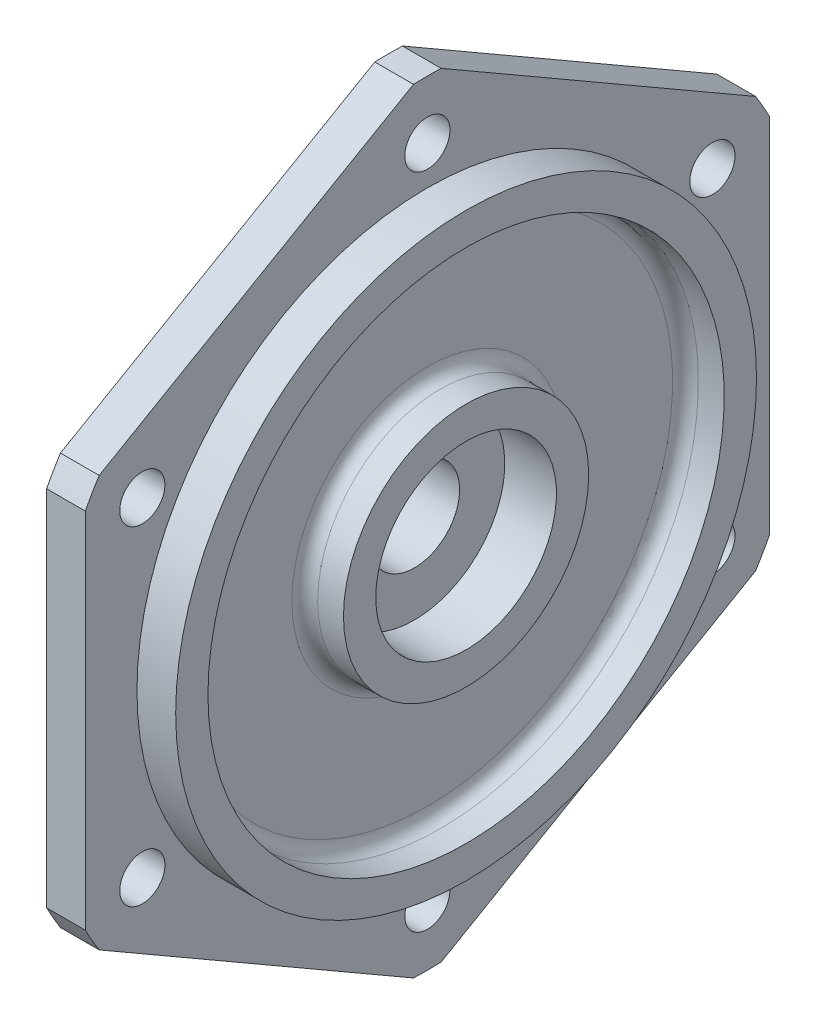
ISO-10303-21;
HEADER;
FILE_DESCRIPTION(('STEP AP214'),'2;1');
FILE_NAME('part.step','',(''),(''),'','','');
FILE_SCHEMA(('AUTOMOTIVE_DESIGN { 1 0 10303 214 1 1 1 1 }'));
ENDSEC;
DATA;
#1=APPLICATION_CONTEXT('core data for automotive mechanical design processes');
#2=APPLICATION_PROTOCOL_DEFINITION('international standard','automotive_design',2000,#1);
#3=PRODUCT_CONTEXT('',#1,'mechanical');
#4=PRODUCT('Part','Part','',(#3));
#5=PRODUCT_RELATED_PRODUCT_CATEGORY('part','',(#4));
#6=PRODUCT_DEFINITION_FORMATION('','',#4);
#7=PRODUCT_DEFINITION_CONTEXT('part definition',#1,'design');
#8=PRODUCT_DEFINITION('design','',#6,#7);
#9=PRODUCT_DEFINITION_SHAPE('','',#8);
#10=(LENGTH_UNIT() NAMED_UNIT(*) SI_UNIT(.MILLI.,.METRE.));
#11=(NAMED_UNIT(*) PLANE_ANGLE_UNIT() SI_UNIT($,.RADIAN.));
#12=(NAMED_UNIT(*) SI_UNIT($,.STERADIAN.) SOLID_ANGLE_UNIT());
#13=UNCERTAINTY_MEASURE_WITH_UNIT(LENGTH_MEASURE(1.E-05),#10,'distance_accuracy_value','');
#14=(GEOMETRIC_REPRESENTATION_CONTEXT(3) GLOBAL_UNCERTAINTY_ASSIGNED_CONTEXT((#13)) GLOBAL_UNIT_ASSIGNED_CONTEXT((#10,
#11,#12)) REPRESENTATION_CONTEXT('',''));
#15=CARTESIAN_POINT('',(0.,0.,0.));
#16=DIRECTION('',(0.,0.,1.));
#17=DIRECTION('',(1.,0.,0.));
#18=AXIS2_PLACEMENT_3D('',#15,#16,#17);
#19=CARTESIAN_POINT('',(-4.,23.,0.));
#20=DIRECTION('',(1.,0.,0.));
#21=DIRECTION('',(0.,0.,-1.));
#22=AXIS2_PLACEMENT_3D('',#19,#20,#21);
#23=PLANE('',#22);
#24=CARTESIAN_POINT('',(-4.,0.,0.));
#25=DIRECTION('',(1.,0.,0.));
#26=DIRECTION('',(0.,0.,-1.));
#27=AXIS2_PLACEMENT_3D('',#24,#25,#26);
#28=CIRCLE('',#27,25.);
#29=CARTESIAN_POINT('',(-4.,0.,-25.));
#30=VERTEX_POINT('',#29);
#31=EDGE_CURVE('E408',#30,#30,#28,.T.);
#32=ORIENTED_EDGE('',*,*,#31,.T.);
#33=EDGE_LOOP('',(#32));
#34=FACE_BOUND('',#33,.T.);
#35=CARTESIAN_POINT('',(-4.,51.,0.));
#36=DIRECTION('',(1.,0.,0.));
#37=DIRECTION('',(0.,0.,-1.));
#38=AXIS2_PLACEMENT_3D('',#35,#36,#37);
#39=CIRCLE('',#38,3.5);
#40=CARTESIAN_POINT('',(-4.,51.,-3.5));
#41=VERTEX_POINT('',#40);
#42=EDGE_CURVE('E220',#41,#41,#39,.T.);
#43=ORIENTED_EDGE('',*,*,#42,.T.);
#44=EDGE_LOOP('',(#43));
#45=FACE_BOUND('',#44,.T.);
#46=CARTESIAN_POINT('',(-4.,25.5,44.1672955930064));
#47=DIRECTION('',(1.,0.,0.));
#48=DIRECTION('',(0.,0.,-1.));
#49=AXIS2_PLACEMENT_3D('',#46,#47,#48);
#50=CIRCLE('',#49,3.49999999999999);
#51=CARTESIAN_POINT('',(-4.,25.5,40.6672955930064));
#52=VERTEX_POINT('',#51);
#53=EDGE_CURVE('E224',#52,#52,#50,.T.);
#54=ORIENTED_EDGE('',*,*,#53,.T.);
#55=EDGE_LOOP('',(#54));
#56=FACE_BOUND('',#55,.T.);
#57=CARTESIAN_POINT('',(-4.,-25.5,44.1672955930064));
#58=DIRECTION('',(1.,0.,0.));
#59=DIRECTION('',(0.,0.,-1.));
#60=AXIS2_PLACEMENT_3D('',#57,#58,#59);
#61=CIRCLE('',#60,3.5);
#62=CARTESIAN_POINT('',(-4.,-25.5,40.6672955930064));
#63=VERTEX_POINT('',#62);
#64=EDGE_CURVE('E228',#63,#63,#61,.T.);
#65=ORIENTED_EDGE('',*,*,#64,.T.);
#66=EDGE_LOOP('',(#65));
#67=FACE_BOUND('',#66,.T.);
#68=CARTESIAN_POINT('',(-4.,-51.,0.));
#69=DIRECTION('',(1.,0.,0.));
#70=DIRECTION('',(0.,0.,-1.));
#71=AXIS2_PLACEMENT_3D('',#68,#69,#70);
#72=CIRCLE('',#71,3.5);
#73=CARTESIAN_POINT('',(-4.,-51.,-3.50000000000001));
#74=VERTEX_POINT('',#73);
#75=EDGE_CURVE('E232',#74,#74,#72,.T.);
#76=ORIENTED_EDGE('',*,*,#75,.T.);
#77=EDGE_LOOP('',(#76));
#78=FACE_BOUND('',#77,.T.);
#79=CARTESIAN_POINT('',(-4.,-25.5,-44.1672955930064));
#80=DIRECTION('',(1.,0.,0.));
#81=DIRECTION('',(0.,0.,-1.));
#82=AXIS2_PLACEMENT_3D('',#79,#80,#81);
#83=CIRCLE('',#82,3.5);
#84=CARTESIAN_POINT('',(-4.,-25.5,-47.6672955930064));
#85=VERTEX_POINT('',#84);
#86=EDGE_CURVE('E236',#85,#85,#83,.T.);
#87=ORIENTED_EDGE('',*,*,#86,.T.);
#88=EDGE_LOOP('',(#87));
#89=FACE_BOUND('',#88,.T.);
#90=CARTESIAN_POINT('',(-4.,25.5,-44.1672955930064));
#91=DIRECTION('',(1.,0.,0.));
#92=DIRECTION('',(0.,0.,-1.));
#93=AXIS2_PLACEMENT_3D('',#90,#91,#92);
#94=CIRCLE('',#93,3.5);
#95=CARTESIAN_POINT('',(-4.,25.5,-47.6672955930064));
#96=VERTEX_POINT('',#95);
#97=EDGE_CURVE('E240',#96,#96,#94,.T.);
#98=ORIENTED_EDGE('',*,*,#97,.T.);
#99=EDGE_LOOP('',(#98));
#100=FACE_BOUND('',#99,.T.);
#101=DIRECTION('',(0.,-1.,0.));
#102=VECTOR('',#101,1.);
#103=CARTESIAN_POINT('',(-4.,0.,-53.));
#104=LINE('',#103,#102);
#105=CARTESIAN_POINT('',(-4.,28.1247222208505,-53.));
#106=VERTEX_POINT('',#105);
#107=CARTESIAN_POINT('',(-4.,-28.1247222208505,-53.));
#108=VERTEX_POINT('',#107);
#109=EDGE_CURVE('E284',#106,#108,#104,.T.);
#110=ORIENTED_EDGE('',*,*,#109,.T.);
#111=CARTESIAN_POINT('',(-4.,0.,0.));
#112=DIRECTION('',(-1.,0.,0.));
#113=DIRECTION('',(0.,0.,1.));
#114=AXIS2_PLACEMENT_3D('',#111,#112,#113);
#115=CIRCLE('',#114,60.);
#116=CARTESIAN_POINT('',(-4.,-31.8369852901501,-50.8567239176372));
#117=VERTEX_POINT('',#116);
#118=EDGE_CURVE('E174',#108,#117,#115,.T.);
#119=ORIENTED_EDGE('',*,*,#118,.T.);
#120=DIRECTION('',(0.,-0.5,0.866025403784439));
#121=VECTOR('',#120,1.);
#122=CARTESIAN_POINT('',(-4.,-45.8993464005753,-26.5));
#123=LINE('',#122,#121);
#124=CARTESIAN_POINT('',(-4.,-59.9617075110005,-2.14327608236285));
#125=VERTEX_POINT('',#124);
#126=EDGE_CURVE('E287',#117,#125,#123,.T.);
#127=ORIENTED_EDGE('',*,*,#126,.T.);
#128=CARTESIAN_POINT('',(-4.,-59.9617075110005,2.1432760823628));
#129=VERTEX_POINT('',#128);
#130=EDGE_CURVE('E168',#125,#129,#115,.T.);
#131=ORIENTED_EDGE('',*,*,#130,.T.);
#132=DIRECTION('',(0.,0.5,0.866025403784439));
#133=VECTOR('',#132,1.);
#134=CARTESIAN_POINT('',(-4.,-45.8993464005753,26.5));
#135=LINE('',#134,#133);
#136=CARTESIAN_POINT('',(-4.,-31.8369852901501,50.8567239176372));
#137=VERTEX_POINT('',#136);
#138=EDGE_CURVE('E297',#129,#137,#135,.T.);
#139=ORIENTED_EDGE('',*,*,#138,.T.);
#140=CARTESIAN_POINT('',(-4.,-28.1247222208505,53.));
#141=VERTEX_POINT('',#140);
#142=EDGE_CURVE('E159',#137,#141,#115,.T.);
#143=ORIENTED_EDGE('',*,*,#142,.T.);
#144=DIRECTION('',(0.,1.,0.));
#145=VECTOR('',#144,1.);
#146=CARTESIAN_POINT('',(-4.,0.,53.));
#147=LINE('',#146,#145);
#148=CARTESIAN_POINT('',(-4.,28.1247222208505,53.));
#149=VERTEX_POINT('',#148);
#150=EDGE_CURVE('E154',#141,#149,#147,.T.);
#151=ORIENTED_EDGE('',*,*,#150,.T.);
#152=CARTESIAN_POINT('',(-4.,31.83698529015,50.8567239176372));
#153=VERTEX_POINT('',#152);
#154=EDGE_CURVE('E146',#149,#153,#115,.T.);
#155=ORIENTED_EDGE('',*,*,#154,.T.);
#156=DIRECTION('',(0.,0.5,-0.866025403784439));
#157=VECTOR('',#156,1.);
#158=CARTESIAN_POINT('',(-4.,45.8993464005752,26.5));
#159=LINE('',#158,#157);
#160=CARTESIAN_POINT('',(-4.,59.9617075110005,2.14327608236283));
#161=VERTEX_POINT('',#160);
#162=EDGE_CURVE('E127',#153,#161,#159,.T.);
#163=ORIENTED_EDGE('',*,*,#162,.T.);
#164=CARTESIAN_POINT('',(-4.,59.9617075110005,-2.14327608236285));
#165=VERTEX_POINT('',#164);
#166=EDGE_CURVE('E157',#161,#165,#115,.T.);
#167=ORIENTED_EDGE('',*,*,#166,.T.);
#168=DIRECTION('',(0.,-0.5,-0.866025403784439));
#169=VECTOR('',#168,1.);
#170=CARTESIAN_POINT('',(-4.,45.8993464005753,-26.5));
#171=LINE('',#170,#169);
#172=CARTESIAN_POINT('',(-4.,31.8369852901501,-50.8567239176372));
#173=VERTEX_POINT('',#172);
#174=EDGE_CURVE('E273',#165,#173,#171,.T.);
#175=ORIENTED_EDGE('',*,*,#174,.T.);
#176=EDGE_CURVE('E165',#173,#106,#115,.T.);
#177=ORIENTED_EDGE('',*,*,#176,.T.);
#178=EDGE_LOOP('',(#110,#119,#127,#131,#139,#143,#151,#155,#163,#167,#175,#177));
#179=FACE_BOUND('',#178,.T.);
#180=ADVANCED_FACE('F39',(#34,#45,#56,#67,#78,#89,#100,#179),#23,.F.);
#181=CARTESIAN_POINT('',(0.,0.,0.));
#182=DIRECTION('',(-1.,0.,0.));
#183=DIRECTION('',(0.,0.,1.));
#184=AXIS2_PLACEMENT_3D('',#181,#182,#183);
#185=CYLINDRICAL_SURFACE('',#184,60.);
#186=DIRECTION('',(-1.,0.,0.));
#187=VECTOR('',#186,1.);
#188=CARTESIAN_POINT('',(6.,-28.1247222208505,-53.));
#189=LINE('',#188,#187);
#190=CARTESIAN_POINT('',(2.,-28.1247222208505,-53.));
#191=VERTEX_POINT('',#190);
#192=EDGE_CURVE('E283',#191,#108,#189,.T.);
#193=ORIENTED_EDGE('',*,*,#192,.F.);
#194=CARTESIAN_POINT('',(2.,0.,0.));
#195=DIRECTION('',(-1.,0.,0.));
#196=DIRECTION('',(0.,0.,1.));
#197=AXIS2_PLACEMENT_3D('',#194,#195,#196);
#198=CIRCLE('',#197,60.);
#199=CARTESIAN_POINT('',(2.,-31.83698529015,-50.8567239176372));
#200=VERTEX_POINT('',#199);
#201=EDGE_CURVE('E191',#191,#200,#198,.T.);
#202=ORIENTED_EDGE('',*,*,#201,.T.);
#203=DIRECTION('',(-1.,0.,0.));
#204=VECTOR('',#203,1.);
#205=CARTESIAN_POINT('',(6.,-31.8369852901501,-50.8567239176372));
#206=LINE('',#205,#204);
#207=EDGE_CURVE('E290',#200,#117,#206,.T.);
#208=ORIENTED_EDGE('',*,*,#207,.T.);
#209=ORIENTED_EDGE('',*,*,#118,.F.);
#210=EDGE_LOOP('',(#193,#202,#208,#209));
#211=FACE_BOUND('',#210,.T.);
#212=ADVANCED_FACE('F356',(#211),#185,.T.);
#213=DIRECTION('',(-1.,0.,0.));
#214=VECTOR('',#213,1.);
#215=CARTESIAN_POINT('',(6.,28.1247222208505,-53.));
#216=LINE('',#215,#214);
#217=CARTESIAN_POINT('',(2.,28.1247222208505,-53.));
#218=VERTEX_POINT('',#217);
#219=EDGE_CURVE('E279',#218,#106,#216,.T.);
#220=ORIENTED_EDGE('',*,*,#219,.T.);
#221=ORIENTED_EDGE('',*,*,#176,.F.);
#222=DIRECTION('',(-1.,0.,0.));
#223=VECTOR('',#222,1.);
#224=CARTESIAN_POINT('',(6.,31.8369852901501,-50.8567239176372));
#225=LINE('',#224,#223);
#226=CARTESIAN_POINT('',(2.,31.8369852901501,-50.8567239176372));
#227=VERTEX_POINT('',#226);
#228=EDGE_CURVE('E265',#227,#173,#225,.T.);
#229=ORIENTED_EDGE('',*,*,#228,.F.);
#230=EDGE_CURVE('E179',#227,#218,#198,.T.);
#231=ORIENTED_EDGE('',*,*,#230,.T.);
#232=EDGE_LOOP('',(#220,#221,#229,#231));
#233=FACE_BOUND('',#232,.T.);
#234=ADVANCED_FACE('F355',(#233),#185,.T.);
#235=DIRECTION('',(-1.,0.,0.));
#236=VECTOR('',#235,1.);
#237=CARTESIAN_POINT('',(6.,-59.9617075110005,-2.14327608236285));
#238=LINE('',#237,#236);
#239=CARTESIAN_POINT('',(2.,-59.9617075110005,-2.14327608236285));
#240=VERTEX_POINT('',#239);
#241=EDGE_CURVE('E294',#240,#125,#238,.T.);
#242=ORIENTED_EDGE('',*,*,#241,.F.);
#243=CARTESIAN_POINT('',(2.,-59.9617075110005,2.1432760823628));
#244=VERTEX_POINT('',#243);
#245=EDGE_CURVE('E183',#240,#244,#198,.T.);
#246=ORIENTED_EDGE('',*,*,#245,.T.);
#247=DIRECTION('',(-1.,0.,0.));
#248=VECTOR('',#247,1.);
#249=CARTESIAN_POINT('',(6.,-59.9617075110005,2.1432760823628));
#250=LINE('',#249,#248);
#251=EDGE_CURVE('E63',#244,#129,#250,.T.);
#252=ORIENTED_EDGE('',*,*,#251,.T.);
#253=ORIENTED_EDGE('',*,*,#130,.F.);
#254=EDGE_LOOP('',(#242,#246,#252,#253));
#255=FACE_BOUND('',#254,.T.);
#256=ADVANCED_FACE('F345',(#255),#185,.T.);
#257=DIRECTION('',(-1.,0.,0.));
#258=VECTOR('',#257,1.);
#259=CARTESIAN_POINT('',(6.,-31.8369852901501,50.8567239176372));
#260=LINE('',#259,#258);
#261=CARTESIAN_POINT('',(2.,-31.8369852901501,50.8567239176372));
#262=VERTEX_POINT('',#261);
#263=EDGE_CURVE('E303',#262,#137,#260,.T.);
#264=ORIENTED_EDGE('',*,*,#263,.F.);
#265=CARTESIAN_POINT('',(2.,-28.1247222208505,53.));
#266=VERTEX_POINT('',#265);
#267=EDGE_CURVE('E176',#262,#266,#198,.T.);
#268=ORIENTED_EDGE('',*,*,#267,.T.);
#269=DIRECTION('',(-1.,0.,0.));
#270=VECTOR('',#269,1.);
#271=CARTESIAN_POINT('',(6.,-28.1247222208505,53.));
#272=LINE('',#271,#270);
#273=EDGE_CURVE('E55',#266,#141,#272,.T.);
#274=ORIENTED_EDGE('',*,*,#273,.T.);
#275=ORIENTED_EDGE('',*,*,#142,.F.);
#276=EDGE_LOOP('',(#264,#268,#274,#275));
#277=FACE_BOUND('',#276,.T.);
#278=ADVANCED_FACE('F347',(#277),#185,.T.);
#279=DIRECTION('',(-1.,0.,0.));
#280=VECTOR('',#279,1.);
#281=CARTESIAN_POINT('',(6.,28.1247222208505,53.));
#282=LINE('',#281,#280);
#283=CARTESIAN_POINT('',(2.,28.1247222208505,53.));
#284=VERTEX_POINT('',#283);
#285=EDGE_CURVE('E139',#284,#149,#282,.T.);
#286=ORIENTED_EDGE('',*,*,#285,.F.);
#287=CARTESIAN_POINT('',(2.,31.83698529015,50.8567239176372));
#288=VERTEX_POINT('',#287);
#289=EDGE_CURVE('E148',#284,#288,#198,.T.);
#290=ORIENTED_EDGE('',*,*,#289,.T.);
#291=DIRECTION('',(-1.,0.,0.));
#292=VECTOR('',#291,1.);
#293=CARTESIAN_POINT('',(6.,31.83698529015,50.8567239176372));
#294=LINE('',#293,#292);
#295=EDGE_CURVE('E130',#288,#153,#294,.T.);
#296=ORIENTED_EDGE('',*,*,#295,.T.);
#297=ORIENTED_EDGE('',*,*,#154,.F.);
#298=EDGE_LOOP('',(#286,#290,#296,#297));
#299=FACE_BOUND('',#298,.T.);
#300=ADVANCED_FACE('F145',(#299),#185,.T.);
#301=DIRECTION('',(-1.,0.,0.));
#302=VECTOR('',#301,1.);
#303=CARTESIAN_POINT('',(6.,59.9617075110005,2.14327608236283));
#304=LINE('',#303,#302);
#305=CARTESIAN_POINT('',(2.,59.9617075110005,2.14327608236283));
#306=VERTEX_POINT('',#305);
#307=EDGE_CURVE('E133',#306,#161,#304,.T.);
#308=ORIENTED_EDGE('',*,*,#307,.F.);
#309=CARTESIAN_POINT('',(2.,59.9617075110005,-2.14327608236285));
#310=VERTEX_POINT('',#309);
#311=EDGE_CURVE('E175',#306,#310,#198,.T.);
#312=ORIENTED_EDGE('',*,*,#311,.T.);
#313=DIRECTION('',(-1.,0.,0.));
#314=VECTOR('',#313,1.);
#315=CARTESIAN_POINT('',(6.,59.9617075110005,-2.14327608236285));
#316=LINE('',#315,#314);
#317=EDGE_CURVE('E269',#310,#165,#316,.T.);
#318=ORIENTED_EDGE('',*,*,#317,.T.);
#319=ORIENTED_EDGE('',*,*,#166,.F.);
#320=EDGE_LOOP('',(#308,#312,#318,#319));
#321=FACE_BOUND('',#320,.T.);
#322=ADVANCED_FACE('F354',(#321),#185,.T.);
#323=CARTESIAN_POINT('',(2.,60.,0.));
#324=DIRECTION('',(-1.,0.,0.));
#325=DIRECTION('',(0.,0.,1.));
#326=AXIS2_PLACEMENT_3D('',#323,#324,#325);
#327=PLANE('',#326);
#328=CARTESIAN_POINT('',(2.,51.,0.));
#329=DIRECTION('',(1.,0.,0.));
#330=DIRECTION('',(0.,0.,-1.));
#331=AXIS2_PLACEMENT_3D('',#328,#329,#330);
#332=CIRCLE('',#331,3.5);
#333=CARTESIAN_POINT('',(2.,51.,-3.5));
#334=VERTEX_POINT('',#333);
#335=EDGE_CURVE('E244',#334,#334,#332,.T.);
#336=ORIENTED_EDGE('',*,*,#335,.F.);
#337=EDGE_LOOP('',(#336));
#338=FACE_BOUND('',#337,.T.);
#339=CARTESIAN_POINT('',(2.,25.5,44.1672955930064));
#340=DIRECTION('',(1.,0.,0.));
#341=DIRECTION('',(0.,0.,-1.));
#342=AXIS2_PLACEMENT_3D('',#339,#340,#341);
#343=CIRCLE('',#342,3.49999999999999);
#344=CARTESIAN_POINT('',(2.,25.5,40.6672955930064));
#345=VERTEX_POINT('',#344);
#346=EDGE_CURVE('E250',#345,#345,#343,.T.);
#347=ORIENTED_EDGE('',*,*,#346,.F.);
#348=EDGE_LOOP('',(#347));
#349=FACE_BOUND('',#348,.T.);
#350=CARTESIAN_POINT('',(2.,-25.5,44.1672955930064));
#351=DIRECTION('',(1.,0.,0.));
#352=DIRECTION('',(0.,0.,-1.));
#353=AXIS2_PLACEMENT_3D('',#350,#351,#352);
#354=CIRCLE('',#353,3.5);
#355=CARTESIAN_POINT('',(2.,-25.5,40.6672955930064));
#356=VERTEX_POINT('',#355);
#357=EDGE_CURVE('E245',#356,#356,#354,.T.);
#358=ORIENTED_EDGE('',*,*,#357,.F.);
#359=EDGE_LOOP('',(#358));
#360=FACE_BOUND('',#359,.T.);
#361=CARTESIAN_POINT('',(2.,-51.,0.));
#362=DIRECTION('',(1.,0.,0.));
#363=DIRECTION('',(0.,0.,-1.));
#364=AXIS2_PLACEMENT_3D('',#361,#362,#363);
#365=CIRCLE('',#364,3.5);
#366=CARTESIAN_POINT('',(2.,-51.,-3.50000000000001));
#367=VERTEX_POINT('',#366);
#368=EDGE_CURVE('E249',#367,#367,#365,.T.);
#369=ORIENTED_EDGE('',*,*,#368,.F.);
#370=EDGE_LOOP('',(#369));
#371=FACE_BOUND('',#370,.T.);
#372=CARTESIAN_POINT('',(2.,-25.5,-44.1672955930064));
#373=DIRECTION('',(1.,0.,0.));
#374=DIRECTION('',(0.,0.,-1.));
#375=AXIS2_PLACEMENT_3D('',#372,#373,#374);
#376=CIRCLE('',#375,3.5);
#377=CARTESIAN_POINT('',(2.,-25.5,-47.6672955930064));
#378=VERTEX_POINT('',#377);
#379=EDGE_CURVE('E254',#378,#378,#376,.T.);
#380=ORIENTED_EDGE('',*,*,#379,.F.);
#381=EDGE_LOOP('',(#380));
#382=FACE_BOUND('',#381,.T.);
#383=CARTESIAN_POINT('',(2.,25.5,-44.1672955930064));
#384=DIRECTION('',(1.,0.,0.));
#385=DIRECTION('',(0.,0.,-1.));
#386=AXIS2_PLACEMENT_3D('',#383,#384,#385);
#387=CIRCLE('',#386,3.5);
#388=CARTESIAN_POINT('',(2.,25.5,-47.6672955930064));
#389=VERTEX_POINT('',#388);
#390=EDGE_CURVE('E258',#389,#389,#387,.T.);
#391=ORIENTED_EDGE('',*,*,#390,.F.);
#392=EDGE_LOOP('',(#391));
#393=FACE_BOUND('',#392,.T.);
#394=CARTESIAN_POINT('',(2.,0.,0.));
#395=DIRECTION('',(-1.,0.,0.));
#396=DIRECTION('',(0.,0.,1.));
#397=AXIS2_PLACEMENT_3D('',#394,#395,#396);
#398=CIRCLE('',#397,45.);
#399=CARTESIAN_POINT('',(2.,0.,45.));
#400=VERTEX_POINT('',#399);
#401=EDGE_CURVE('E184',#400,#400,#398,.T.);
#402=ORIENTED_EDGE('',*,*,#401,.T.);
#403=EDGE_LOOP('',(#402));
#404=FACE_BOUND('',#403,.T.);
#405=DIRECTION('',(0.,-1.,0.));
#406=VECTOR('',#405,1.);
#407=CARTESIAN_POINT('',(2.,60.,-53.));
#408=LINE('',#407,#406);
#409=EDGE_CURVE('E11',#218,#191,#408,.T.);
#410=ORIENTED_EDGE('',*,*,#409,.F.);
#411=ORIENTED_EDGE('',*,*,#230,.F.);
#412=DIRECTION('',(0.,-0.5,-0.866025403784439));
#413=VECTOR('',#412,1.);
#414=CARTESIAN_POINT('',(2.,60.8993464005753,-0.519237886466848));
#415=LINE('',#414,#413);
#416=EDGE_CURVE('E324',#310,#227,#415,.T.);
#417=ORIENTED_EDGE('',*,*,#416,.F.);
#418=ORIENTED_EDGE('',*,*,#311,.F.);
#419=DIRECTION('',(0.,0.5,-0.866025403784439));
#420=VECTOR('',#419,1.);
#421=CARTESIAN_POINT('',(2.,60.8993464005752,0.519237886466841));
#422=LINE('',#421,#420);
#423=EDGE_CURVE('E321',#288,#306,#422,.T.);
#424=ORIENTED_EDGE('',*,*,#423,.F.);
#425=ORIENTED_EDGE('',*,*,#289,.F.);
#426=DIRECTION('',(0.,1.,0.));
#427=VECTOR('',#426,1.);
#428=CARTESIAN_POINT('',(2.,60.,53.));
#429=LINE('',#428,#427);
#430=EDGE_CURVE('E316',#266,#284,#429,.T.);
#431=ORIENTED_EDGE('',*,*,#430,.F.);
#432=ORIENTED_EDGE('',*,*,#267,.F.);
#433=DIRECTION('',(0.,0.5,0.866025403784439));
#434=VECTOR('',#433,1.);
#435=CARTESIAN_POINT('',(2.,-30.8993464005753,52.4807621135331));
#436=LINE('',#435,#434);
#437=EDGE_CURVE('E328',#244,#262,#436,.T.);
#438=ORIENTED_EDGE('',*,*,#437,.F.);
#439=ORIENTED_EDGE('',*,*,#245,.F.);
#440=DIRECTION('',(0.,-0.5,0.866025403784439));
#441=VECTOR('',#440,1.);
#442=CARTESIAN_POINT('',(2.,-30.8993464005753,-52.4807621135332));
#443=LINE('',#442,#441);
#444=EDGE_CURVE('E48',#200,#240,#443,.T.);
#445=ORIENTED_EDGE('',*,*,#444,.F.);
#446=ORIENTED_EDGE('',*,*,#201,.F.);
#447=EDGE_LOOP('',(#410,#411,#417,#418,#424,#425,#431,#432,#438,#439,#445,#446));
#448=FACE_BOUND('',#447,.T.);
#449=ADVANCED_FACE('F319',(#338,#349,#360,#371,#382,#393,#404,#448),#327,.F.);
#450=CARTESIAN_POINT('',(0.,0.,0.));
#451=DIRECTION('',(-1.,0.,0.));
#452=DIRECTION('',(0.,0.,1.));
#453=AXIS2_PLACEMENT_3D('',#450,#451,#452);
#454=CYLINDRICAL_SURFACE('',#453,7.);
#455=CARTESIAN_POINT('',(0.,0.,0.));
#456=DIRECTION('',(-1.,0.,0.));
#457=DIRECTION('',(0.,0.,1.));
#458=AXIS2_PLACEMENT_3D('',#455,#456,#457);
#459=CIRCLE('',#458,7.);
#460=CARTESIAN_POINT('',(0.,0.,7.));
#461=VERTEX_POINT('',#460);
#462=EDGE_CURVE('E216',#461,#461,#459,.T.);
#463=ORIENTED_EDGE('',*,*,#462,.F.);
#464=EDGE_LOOP('',(#463));
#465=FACE_BOUND('',#464,.T.);
#466=CARTESIAN_POINT('',(-8.,0.,0.));
#467=DIRECTION('',(-1.,0.,0.));
#468=DIRECTION('',(0.,0.,1.));
#469=AXIS2_PLACEMENT_3D('',#466,#467,#468);
#470=CIRCLE('',#469,7.);
#471=CARTESIAN_POINT('',(-8.,0.,7.));
#472=VERTEX_POINT('',#471);
#473=EDGE_CURVE('E163',#472,#472,#470,.T.);
#474=ORIENTED_EDGE('',*,*,#473,.T.);
#475=EDGE_LOOP('',(#474));
#476=FACE_BOUND('',#475,.T.);
#477=ADVANCED_FACE('F376',(#465,#476),#454,.F.);
#478=CARTESIAN_POINT('',(-8.,7.,0.));
#479=DIRECTION('',(1.,0.,0.));
#480=DIRECTION('',(0.,0.,-1.));
#481=AXIS2_PLACEMENT_3D('',#478,#479,#480);
#482=PLANE('',#481);
#483=ORIENTED_EDGE('',*,*,#473,.F.);
#484=EDGE_LOOP('',(#483));
#485=FACE_BOUND('',#484,.T.);
#486=CARTESIAN_POINT('',(-8.,0.,0.));
#487=DIRECTION('',(-1.,0.,0.));
#488=DIRECTION('',(0.,0.,1.));
#489=AXIS2_PLACEMENT_3D('',#486,#487,#488);
#490=CIRCLE('',#489,23.);
#491=CARTESIAN_POINT('',(-8.,0.,23.));
#492=VERTEX_POINT('',#491);
#493=EDGE_CURVE('E156',#492,#492,#490,.T.);
#494=ORIENTED_EDGE('',*,*,#493,.T.);
#495=EDGE_LOOP('',(#494));
#496=FACE_BOUND('',#495,.T.);
#497=ADVANCED_FACE('F372',(#485,#496),#482,.F.);
#498=CARTESIAN_POINT('',(0.,0.,0.));
#499=DIRECTION('',(-1.,0.,0.));
#500=DIRECTION('',(0.,0.,1.));
#501=AXIS2_PLACEMENT_3D('',#498,#499,#500);
#502=CYLINDRICAL_SURFACE('',#501,23.);
#503=CARTESIAN_POINT('',(-6.,0.,0.));
#504=DIRECTION('',(1.,0.,0.));
#505=DIRECTION('',(0.,0.,-1.));
#506=AXIS2_PLACEMENT_3D('',#503,#504,#505);
#507=CIRCLE('',#506,23.);
#508=CARTESIAN_POINT('',(-6.,0.,-23.));
#509=VERTEX_POINT('',#508);
#510=EDGE_CURVE('E745',#509,#509,#507,.F.);
#511=ORIENTED_EDGE('',*,*,#510,.T.);
#512=EDGE_LOOP('',(#511));
#513=FACE_BOUND('',#512,.T.);
#514=ORIENTED_EDGE('',*,*,#493,.F.);
#515=EDGE_LOOP('',(#514));
#516=FACE_BOUND('',#515,.T.);
#517=ADVANCED_FACE('F368',(#513,#516),#502,.T.);
#518=CARTESIAN_POINT('',(0.,0.,0.));
#519=DIRECTION('',(-1.,0.,0.));
#520=DIRECTION('',(0.,0.,1.));
#521=AXIS2_PLACEMENT_3D('',#518,#519,#520);
#522=CYLINDRICAL_SURFACE('',#521,45.);
#523=ORIENTED_EDGE('',*,*,#401,.F.);
#524=EDGE_LOOP('',(#523));
#525=FACE_BOUND('',#524,.T.);
#526=CARTESIAN_POINT('',(8.,0.,0.));
#527=DIRECTION('',(-1.,0.,0.));
#528=DIRECTION('',(0.,0.,1.));
#529=AXIS2_PLACEMENT_3D('',#526,#527,#528);
#530=CIRCLE('',#529,45.);
#531=CARTESIAN_POINT('',(8.,0.,45.));
#532=VERTEX_POINT('',#531);
#533=EDGE_CURVE('E193',#532,#532,#530,.T.);
#534=ORIENTED_EDGE('',*,*,#533,.T.);
#535=EDGE_LOOP('',(#534));
#536=FACE_BOUND('',#535,.T.);
#537=ADVANCED_FACE('F371',(#525,#536),#522,.T.);
#538=CARTESIAN_POINT('',(8.,45.,0.));
#539=DIRECTION('',(-1.,0.,0.));
#540=DIRECTION('',(0.,0.,1.));
#541=AXIS2_PLACEMENT_3D('',#538,#539,#540);
#542=PLANE('',#541);
#543=ORIENTED_EDGE('',*,*,#533,.F.);
#544=EDGE_LOOP('',(#543));
#545=FACE_BOUND('',#544,.T.);
#546=CARTESIAN_POINT('',(8.,0.,0.));
#547=DIRECTION('',(-1.,0.,0.));
#548=DIRECTION('',(0.,0.,1.));
#549=AXIS2_PLACEMENT_3D('',#546,#547,#548);
#550=CIRCLE('',#549,40.);
#551=CARTESIAN_POINT('',(8.,0.,40.));
#552=VERTEX_POINT('',#551);
#553=EDGE_CURVE('E198',#552,#552,#550,.T.);
#554=ORIENTED_EDGE('',*,*,#553,.T.);
#555=EDGE_LOOP('',(#554));
#556=FACE_BOUND('',#555,.T.);
#557=ADVANCED_FACE('F420',(#545,#556),#542,.F.);
#558=CARTESIAN_POINT('',(0.,0.,0.));
#559=DIRECTION('',(-1.,0.,0.));
#560=DIRECTION('',(0.,0.,1.));
#561=AXIS2_PLACEMENT_3D('',#558,#559,#560);
#562=CYLINDRICAL_SURFACE('',#561,40.);
#563=CARTESIAN_POINT('',(4.,0.,0.));
#564=DIRECTION('',(-1.,0.,0.));
#565=DIRECTION('',(0.,0.,1.));
#566=AXIS2_PLACEMENT_3D('',#563,#564,#565);
#567=CIRCLE('',#566,40.);
#568=CARTESIAN_POINT('',(4.,0.,40.));
#569=VERTEX_POINT('',#568);
#570=EDGE_CURVE('E330',#569,#569,#567,.T.);
#571=ORIENTED_EDGE('',*,*,#570,.T.);
#572=EDGE_LOOP('',(#571));
#573=FACE_BOUND('',#572,.T.);
#574=ORIENTED_EDGE('',*,*,#553,.F.);
#575=EDGE_LOOP('',(#574));
#576=FACE_BOUND('',#575,.T.);
#577=ADVANCED_FACE('F415',(#573,#576),#562,.F.);
#578=CARTESIAN_POINT('',(2.,40.,0.));
#579=DIRECTION('',(-1.,0.,0.));
#580=DIRECTION('',(0.,0.,1.));
#581=AXIS2_PLACEMENT_3D('',#578,#579,#580);
#582=PLANE('',#581);
#583=CARTESIAN_POINT('',(2.,0.,0.));
#584=DIRECTION('',(-1.,0.,0.));
#585=DIRECTION('',(0.,0.,1.));
#586=AXIS2_PLACEMENT_3D('',#583,#584,#585);
#587=CIRCLE('',#586,21.);
#588=CARTESIAN_POINT('',(2.,0.,21.));
#589=VERTEX_POINT('',#588);
#590=EDGE_CURVE('E399',#589,#589,#587,.T.);
#591=ORIENTED_EDGE('',*,*,#590,.T.);
#592=EDGE_LOOP('',(#591));
#593=FACE_BOUND('',#592,.T.);
#594=CARTESIAN_POINT('',(2.,0.,0.));
#595=DIRECTION('',(-1.,0.,0.));
#596=DIRECTION('',(0.,0.,1.));
#597=AXIS2_PLACEMENT_3D('',#594,#595,#596);
#598=CIRCLE('',#597,38.);
#599=CARTESIAN_POINT('',(2.,0.,38.));
#600=VERTEX_POINT('',#599);
#601=EDGE_CURVE('E402',#600,#600,#598,.F.);
#602=ORIENTED_EDGE('',*,*,#601,.T.);
#603=EDGE_LOOP('',(#602));
#604=FACE_BOUND('',#603,.T.);
#605=ADVANCED_FACE('F419',(#593,#604),#582,.F.);
#606=CARTESIAN_POINT('',(0.,0.,0.));
#607=DIRECTION('',(-1.,0.,0.));
#608=DIRECTION('',(0.,0.,1.));
#609=AXIS2_PLACEMENT_3D('',#606,#607,#608);
#610=CYLINDRICAL_SURFACE('',#609,19.);
#611=CARTESIAN_POINT('',(4.,0.,0.));
#612=DIRECTION('',(-1.,0.,0.));
#613=DIRECTION('',(0.,0.,1.));
#614=AXIS2_PLACEMENT_3D('',#611,#612,#613);
#615=CIRCLE('',#614,19.);
#616=CARTESIAN_POINT('',(4.,0.,19.));
#617=VERTEX_POINT('',#616);
#618=EDGE_CURVE('E396',#617,#617,#615,.F.);
#619=ORIENTED_EDGE('',*,*,#618,.T.);
#620=EDGE_LOOP('',(#619));
#621=FACE_BOUND('',#620,.T.);
#622=CARTESIAN_POINT('',(8.,0.,0.));
#623=DIRECTION('',(-1.,0.,0.));
#624=DIRECTION('',(0.,0.,1.));
#625=AXIS2_PLACEMENT_3D('',#622,#623,#624);
#626=CIRCLE('',#625,19.);
#627=CARTESIAN_POINT('',(8.,0.,19.));
#628=VERTEX_POINT('',#627);
#629=EDGE_CURVE('E204',#628,#628,#626,.T.);
#630=ORIENTED_EDGE('',*,*,#629,.T.);
#631=EDGE_LOOP('',(#630));
#632=FACE_BOUND('',#631,.T.);
#633=ADVANCED_FACE('F487',(#621,#632),#610,.T.);
#634=CARTESIAN_POINT('',(8.,19.,0.));
#635=DIRECTION('',(-1.,0.,0.));
#636=DIRECTION('',(0.,0.,1.));
#637=AXIS2_PLACEMENT_3D('',#634,#635,#636);
#638=PLANE('',#637);
#639=ORIENTED_EDGE('',*,*,#629,.F.);
#640=EDGE_LOOP('',(#639));
#641=FACE_BOUND('',#640,.T.);
#642=CARTESIAN_POINT('',(8.,0.,0.));
#643=DIRECTION('',(-1.,0.,0.));
#644=DIRECTION('',(0.,0.,1.));
#645=AXIS2_PLACEMENT_3D('',#642,#643,#644);
#646=CIRCLE('',#645,14.);
#647=CARTESIAN_POINT('',(8.,0.,14.));
#648=VERTEX_POINT('',#647);
#649=EDGE_CURVE('E208',#648,#648,#646,.T.);
#650=ORIENTED_EDGE('',*,*,#649,.T.);
#651=EDGE_LOOP('',(#650));
#652=FACE_BOUND('',#651,.T.);
#653=ADVANCED_FACE('F483',(#641,#652),#638,.F.);
#654=CARTESIAN_POINT('',(0.,0.,0.));
#655=DIRECTION('',(-1.,0.,0.));
#656=DIRECTION('',(0.,0.,1.));
#657=AXIS2_PLACEMENT_3D('',#654,#655,#656);
#658=CYLINDRICAL_SURFACE('',#657,14.);
#659=ORIENTED_EDGE('',*,*,#649,.F.);
#660=EDGE_LOOP('',(#659));
#661=FACE_BOUND('',#660,.T.);
#662=CARTESIAN_POINT('',(0.,0.,0.));
#663=DIRECTION('',(-1.,0.,0.));
#664=DIRECTION('',(0.,0.,1.));
#665=AXIS2_PLACEMENT_3D('',#662,#663,#664);
#666=CIRCLE('',#665,14.);
#667=CARTESIAN_POINT('',(0.,0.,14.));
#668=VERTEX_POINT('',#667);
#669=EDGE_CURVE('E212',#668,#668,#666,.T.);
#670=ORIENTED_EDGE('',*,*,#669,.T.);
#671=EDGE_LOOP('',(#670));
#672=FACE_BOUND('',#671,.T.);
#673=ADVANCED_FACE('F467',(#661,#672),#658,.F.);
#674=CARTESIAN_POINT('',(0.,14.,0.));
#675=DIRECTION('',(-1.,0.,0.));
#676=DIRECTION('',(0.,0.,1.));
#677=AXIS2_PLACEMENT_3D('',#674,#675,#676);
#678=PLANE('',#677);
#679=ORIENTED_EDGE('',*,*,#669,.F.);
#680=EDGE_LOOP('',(#679));
#681=FACE_BOUND('',#680,.T.);
#682=ORIENTED_EDGE('',*,*,#462,.T.);
#683=EDGE_LOOP('',(#682));
#684=FACE_BOUND('',#683,.T.);
#685=ADVANCED_FACE('F456',(#681,#684),#678,.F.);
#686=CARTESIAN_POINT('',(-8.,25.5,-44.1672955930064));
#687=DIRECTION('',(1.,0.,0.));
#688=DIRECTION('',(0.,0.,-1.));
#689=AXIS2_PLACEMENT_3D('',#686,#687,#688);
#690=CYLINDRICAL_SURFACE('',#689,3.5);
#691=ORIENTED_EDGE('',*,*,#390,.T.);
#692=EDGE_LOOP('',(#691));
#693=FACE_BOUND('',#692,.T.);
#694=ORIENTED_EDGE('',*,*,#97,.F.);
#695=EDGE_LOOP('',(#694));
#696=FACE_BOUND('',#695,.T.);
#697=ADVANCED_FACE('F452',(#693,#696),#690,.F.);
#698=CARTESIAN_POINT('',(-8.,-25.5,-44.1672955930064));
#699=DIRECTION('',(1.,0.,0.));
#700=DIRECTION('',(0.,0.,-1.));
#701=AXIS2_PLACEMENT_3D('',#698,#699,#700);
#702=CYLINDRICAL_SURFACE('',#701,3.5);
#703=ORIENTED_EDGE('',*,*,#379,.T.);
#704=EDGE_LOOP('',(#703));
#705=FACE_BOUND('',#704,.T.);
#706=ORIENTED_EDGE('',*,*,#86,.F.);
#707=EDGE_LOOP('',(#706));
#708=FACE_BOUND('',#707,.T.);
#709=ADVANCED_FACE('F455',(#705,#708),#702,.F.);
#710=CARTESIAN_POINT('',(-8.,-51.,0.));
#711=DIRECTION('',(1.,0.,0.));
#712=DIRECTION('',(0.,0.,-1.));
#713=AXIS2_PLACEMENT_3D('',#710,#711,#712);
#714=CYLINDRICAL_SURFACE('',#713,3.5);
#715=ORIENTED_EDGE('',*,*,#368,.T.);
#716=EDGE_LOOP('',(#715));
#717=FACE_BOUND('',#716,.T.);
#718=ORIENTED_EDGE('',*,*,#75,.F.);
#719=EDGE_LOOP('',(#718));
#720=FACE_BOUND('',#719,.T.);
#721=ADVANCED_FACE('F464',(#717,#720),#714,.F.);
#722=CARTESIAN_POINT('',(-8.,-25.5,44.1672955930064));
#723=DIRECTION('',(1.,0.,0.));
#724=DIRECTION('',(0.,0.,-1.));
#725=AXIS2_PLACEMENT_3D('',#722,#723,#724);
#726=CYLINDRICAL_SURFACE('',#725,3.5);
#727=ORIENTED_EDGE('',*,*,#357,.T.);
#728=EDGE_LOOP('',(#727));
#729=FACE_BOUND('',#728,.T.);
#730=ORIENTED_EDGE('',*,*,#64,.F.);
#731=EDGE_LOOP('',(#730));
#732=FACE_BOUND('',#731,.T.);
#733=ADVANCED_FACE('F476',(#729,#732),#726,.F.);
#734=CARTESIAN_POINT('',(-8.,25.5,44.1672955930064));
#735=DIRECTION('',(1.,0.,0.));
#736=DIRECTION('',(0.,0.,-1.));
#737=AXIS2_PLACEMENT_3D('',#734,#735,#736);
#738=CYLINDRICAL_SURFACE('',#737,3.49999999999999);
#739=ORIENTED_EDGE('',*,*,#346,.T.);
#740=EDGE_LOOP('',(#739));
#741=FACE_BOUND('',#740,.T.);
#742=ORIENTED_EDGE('',*,*,#53,.F.);
#743=EDGE_LOOP('',(#742));
#744=FACE_BOUND('',#743,.T.);
#745=ADVANCED_FACE('F471',(#741,#744),#738,.F.);
#746=CARTESIAN_POINT('',(-8.,51.,0.));
#747=DIRECTION('',(1.,0.,0.));
#748=DIRECTION('',(0.,0.,-1.));
#749=AXIS2_PLACEMENT_3D('',#746,#747,#748);
#750=CYLINDRICAL_SURFACE('',#749,3.5);
#751=ORIENTED_EDGE('',*,*,#335,.T.);
#752=EDGE_LOOP('',(#751));
#753=FACE_BOUND('',#752,.T.);
#754=ORIENTED_EDGE('',*,*,#42,.F.);
#755=EDGE_LOOP('',(#754));
#756=FACE_BOUND('',#755,.T.);
#757=ADVANCED_FACE('F384',(#753,#756),#750,.F.);
#758=CARTESIAN_POINT('',(-6.,0.,0.));
#759=DIRECTION('',(1.,0.,0.));
#760=DIRECTION('',(0.,0.,-1.));
#761=AXIS2_PLACEMENT_3D('',#758,#759,#760);
#762=TOROIDAL_SURFACE('',#761,25.,2.);
#763=ORIENTED_EDGE('',*,*,#31,.F.);
#764=EDGE_LOOP('',(#763));
#765=FACE_BOUND('',#764,.T.);
#766=ORIENTED_EDGE('',*,*,#510,.F.);
#767=EDGE_LOOP('',(#766));
#768=FACE_BOUND('',#767,.T.);
#769=ADVANCED_FACE('F381',(#765,#768),#762,.F.);
#770=CARTESIAN_POINT('',(4.,0.,0.));
#771=DIRECTION('',(-1.,0.,0.));
#772=DIRECTION('',(0.,0.,1.));
#773=AXIS2_PLACEMENT_3D('',#770,#771,#772);
#774=TOROIDAL_SURFACE('',#773,21.,2.);
#775=ORIENTED_EDGE('',*,*,#618,.F.);
#776=EDGE_LOOP('',(#775));
#777=FACE_BOUND('',#776,.T.);
#778=ORIENTED_EDGE('',*,*,#590,.F.);
#779=EDGE_LOOP('',(#778));
#780=FACE_BOUND('',#779,.T.);
#781=ADVANCED_FACE('F383',(#777,#780),#774,.F.);
#782=CARTESIAN_POINT('',(4.,0.,0.));
#783=DIRECTION('',(-1.,0.,0.));
#784=DIRECTION('',(0.,0.,1.));
#785=AXIS2_PLACEMENT_3D('',#782,#783,#784);
#786=TOROIDAL_SURFACE('',#785,38.,2.);
#787=ORIENTED_EDGE('',*,*,#601,.F.);
#788=EDGE_LOOP('',(#787));
#789=FACE_BOUND('',#788,.T.);
#790=ORIENTED_EDGE('',*,*,#570,.F.);
#791=EDGE_LOOP('',(#790));
#792=FACE_BOUND('',#791,.T.);
#793=ADVANCED_FACE('F41',(#789,#792),#786,.F.);
#794=CARTESIAN_POINT('',(6.,45.8993464005753,-26.5));
#795=DIRECTION('',(0.,0.866025403784439,-0.5));
#796=DIRECTION('',(0.,0.5,0.866025403784439));
#797=AXIS2_PLACEMENT_3D('',#794,#795,#796);
#798=PLANE('',#797);
#799=ORIENTED_EDGE('',*,*,#416,.T.);
#800=ORIENTED_EDGE('',*,*,#228,.T.);
#801=ORIENTED_EDGE('',*,*,#174,.F.);
#802=ORIENTED_EDGE('',*,*,#317,.F.);
#803=EDGE_LOOP('',(#799,#800,#801,#802));
#804=FACE_BOUND('',#803,.T.);
#805=ADVANCED_FACE('F391',(#804),#798,.T.);
#806=CARTESIAN_POINT('',(6.,45.8993464005752,26.5));
#807=DIRECTION('',(0.,0.866025403784439,0.5));
#808=DIRECTION('',(0.,-0.5,0.866025403784439));
#809=AXIS2_PLACEMENT_3D('',#806,#807,#808);
#810=PLANE('',#809);
#811=ORIENTED_EDGE('',*,*,#423,.T.);
#812=ORIENTED_EDGE('',*,*,#307,.T.);
#813=ORIENTED_EDGE('',*,*,#162,.F.);
#814=ORIENTED_EDGE('',*,*,#295,.F.);
#815=EDGE_LOOP('',(#811,#812,#813,#814));
#816=FACE_BOUND('',#815,.T.);
#817=ADVANCED_FACE('F129',(#816),#810,.T.);
#818=CARTESIAN_POINT('',(6.,0.,53.));
#819=DIRECTION('',(0.,0.,1.));
#820=DIRECTION('',(0.,-1.,0.));
#821=AXIS2_PLACEMENT_3D('',#818,#819,#820);
#822=PLANE('',#821);
#823=ORIENTED_EDGE('',*,*,#430,.T.);
#824=ORIENTED_EDGE('',*,*,#285,.T.);
#825=ORIENTED_EDGE('',*,*,#150,.F.);
#826=ORIENTED_EDGE('',*,*,#273,.F.);
#827=EDGE_LOOP('',(#823,#824,#825,#826));
#828=FACE_BOUND('',#827,.T.);
#829=ADVANCED_FACE('F315',(#828),#822,.T.);
#830=CARTESIAN_POINT('',(6.,-45.8993464005753,26.5));
#831=DIRECTION('',(0.,-0.866025403784439,0.5));
#832=DIRECTION('',(0.,-0.5,-0.866025403784439));
#833=AXIS2_PLACEMENT_3D('',#830,#831,#832);
#834=PLANE('',#833);
#835=ORIENTED_EDGE('',*,*,#437,.T.);
#836=ORIENTED_EDGE('',*,*,#263,.T.);
#837=ORIENTED_EDGE('',*,*,#138,.F.);
#838=ORIENTED_EDGE('',*,*,#251,.F.);
#839=EDGE_LOOP('',(#835,#836,#837,#838));
#840=FACE_BOUND('',#839,.T.);
#841=ADVANCED_FACE('F346',(#840),#834,.T.);
#842=CARTESIAN_POINT('',(6.,-45.8993464005753,-26.5));
#843=DIRECTION('',(0.,-0.866025403784439,-0.5));
#844=DIRECTION('',(0.,0.5,-0.866025403784439));
#845=AXIS2_PLACEMENT_3D('',#842,#843,#844);
#846=PLANE('',#845);
#847=ORIENTED_EDGE('',*,*,#444,.T.);
#848=ORIENTED_EDGE('',*,*,#241,.T.);
#849=ORIENTED_EDGE('',*,*,#126,.F.);
#850=ORIENTED_EDGE('',*,*,#207,.F.);
#851=EDGE_LOOP('',(#847,#848,#849,#850));
#852=FACE_BOUND('',#851,.T.);
#853=ADVANCED_FACE('F339',(#852),#846,.T.);
#854=CARTESIAN_POINT('',(6.,0.,-53.));
#855=DIRECTION('',(0.,0.,-1.));
#856=DIRECTION('',(-1.,0.,0.));
#857=AXIS2_PLACEMENT_3D('',#854,#855,#856);
#858=PLANE('',#857);
#859=ORIENTED_EDGE('',*,*,#409,.T.);
#860=ORIENTED_EDGE('',*,*,#192,.T.);
#861=ORIENTED_EDGE('',*,*,#109,.F.);
#862=ORIENTED_EDGE('',*,*,#219,.F.);
#863=EDGE_LOOP('',(#859,#860,#861,#862));
#864=FACE_BOUND('',#863,.T.);
#865=ADVANCED_FACE('F694',(#864),#858,.T.);
#866=CLOSED_SHELL('',(#180,#212,#234,#256,#278,#300,#322,#449,#477,#497,#517,#537,#557,#577,
#605,#633,#653,#673,#685,#697,#709,#721,#733,#745,#757,#769,#781,#793,#805,#817,#829,#841,#853,#865));
#867=MANIFOLD_SOLID_BREP('B2',#866);
#868=ADVANCED_BREP_SHAPE_REPRESENTATION('',(#18,#867),#14);
#869=SHAPE_DEFINITION_REPRESENTATION(#9,#868);
ENDSEC;
END-ISO-10303-21;
